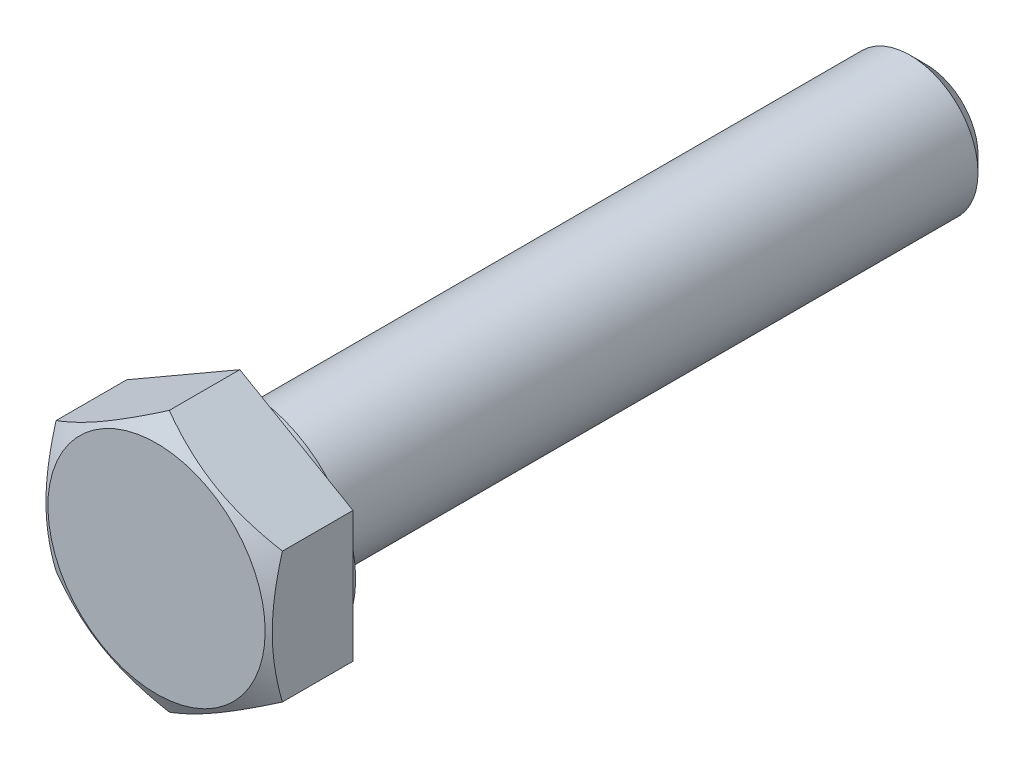
ISO-10303-21;
HEADER;
FILE_DESCRIPTION(('STEP AP214'),'2;1');
FILE_NAME('part.step','',(''),(''),'','','');
FILE_SCHEMA(('AUTOMOTIVE_DESIGN { 1 0 10303 214 1 1 1 1 }'));
ENDSEC;
DATA;
#1=APPLICATION_CONTEXT('core data for automotive mechanical design processes');
#2=APPLICATION_PROTOCOL_DEFINITION('international standard','automotive_design',2000,#1);
#3=PRODUCT_CONTEXT('',#1,'mechanical');
#4=PRODUCT('Part','Part','',(#3));
#5=PRODUCT_RELATED_PRODUCT_CATEGORY('part','',(#4));
#6=PRODUCT_DEFINITION_FORMATION('','',#4);
#7=PRODUCT_DEFINITION_CONTEXT('part definition',#1,'design');
#8=PRODUCT_DEFINITION('design','',#6,#7);
#9=PRODUCT_DEFINITION_SHAPE('','',#8);
#10=(LENGTH_UNIT() NAMED_UNIT(*) SI_UNIT(.MILLI.,.METRE.));
#11=(NAMED_UNIT(*) PLANE_ANGLE_UNIT() SI_UNIT($,.RADIAN.));
#12=(NAMED_UNIT(*) SI_UNIT($,.STERADIAN.) SOLID_ANGLE_UNIT());
#13=UNCERTAINTY_MEASURE_WITH_UNIT(LENGTH_MEASURE(1.E-05),#10,'distance_accuracy_value','');
#14=(GEOMETRIC_REPRESENTATION_CONTEXT(3) GLOBAL_UNCERTAINTY_ASSIGNED_CONTEXT((#13)) GLOBAL_UNIT_ASSIGNED_CONTEXT((#10,
#11,#12)) REPRESENTATION_CONTEXT('',''));
#15=CARTESIAN_POINT('',(0.,0.,0.));
#16=DIRECTION('',(0.,0.,1.));
#17=DIRECTION('',(1.,0.,0.));
#18=AXIS2_PLACEMENT_3D('',#15,#16,#17);
#19=CARTESIAN_POINT('',(0.,5.77350269189626,13.32));
#20=DIRECTION('',(0.,0.,1.));
#21=DIRECTION('',(1.,0.,0.));
#22=AXIS2_PLACEMENT_3D('',#19,#20,#21);
#23=PLANE('',#22);
#24=CARTESIAN_POINT('',(0.,0.,13.32));
#25=DIRECTION('',(0.,0.,1.));
#26=DIRECTION('',(1.,0.,0.));
#27=AXIS2_PLACEMENT_3D('',#24,#25,#26);
#28=CIRCLE('',#27,4.8);
#29=CARTESIAN_POINT('',(4.8,0.,13.32));
#30=VERTEX_POINT('',#29);
#31=EDGE_CURVE('E186',#30,#30,#28,.T.);
#32=ORIENTED_EDGE('',*,*,#31,.T.);
#33=EDGE_LOOP('',(#32));
#34=FACE_BOUND('',#33,.T.);
#35=DIRECTION('',(0.,1.,0.));
#36=VECTOR('',#35,1.);
#37=CARTESIAN_POINT('',(5.,5.77350269189626,13.32));
#38=LINE('',#37,#36);
#39=CARTESIAN_POINT('',(5.,-2.88675134594813,13.32));
#40=VERTEX_POINT('',#39);
#41=CARTESIAN_POINT('',(5.,2.88675134594813,13.32));
#42=VERTEX_POINT('',#41);
#43=EDGE_CURVE('E12',#40,#42,#38,.T.);
#44=ORIENTED_EDGE('',*,*,#43,.F.);
#45=DIRECTION('',(0.866025403784439,0.5,0.));
#46=VECTOR('',#45,1.);
#47=CARTESIAN_POINT('',(5.,-2.88675134594813,13.32));
#48=LINE('',#47,#46);
#49=CARTESIAN_POINT('',(0.,-5.77350269189626,13.32));
#50=VERTEX_POINT('',#49);
#51=EDGE_CURVE('E46',#50,#40,#48,.T.);
#52=ORIENTED_EDGE('',*,*,#51,.F.);
#53=DIRECTION('',(0.866025403784439,-0.5,0.));
#54=VECTOR('',#53,1.);
#55=CARTESIAN_POINT('',(-5.,-2.88675134594813,13.32));
#56=LINE('',#55,#54);
#57=CARTESIAN_POINT('',(-5.,-2.88675134594813,13.32));
#58=VERTEX_POINT('',#57);
#59=EDGE_CURVE('E108',#58,#50,#56,.T.);
#60=ORIENTED_EDGE('',*,*,#59,.F.);
#61=DIRECTION('',(0.,-1.,0.));
#62=VECTOR('',#61,1.);
#63=CARTESIAN_POINT('',(-5.,5.77350269189626,13.32));
#64=LINE('',#63,#62);
#65=CARTESIAN_POINT('',(-5.,2.88675134594813,13.32));
#66=VERTEX_POINT('',#65);
#67=EDGE_CURVE('E106',#66,#58,#64,.T.);
#68=ORIENTED_EDGE('',*,*,#67,.F.);
#69=DIRECTION('',(-0.866025403784439,-0.5,0.));
#70=VECTOR('',#69,1.);
#71=CARTESIAN_POINT('',(0.,5.77350269189626,13.32));
#72=LINE('',#71,#70);
#73=CARTESIAN_POINT('',(0.,5.77350269189626,13.32));
#74=VERTEX_POINT('',#73);
#75=EDGE_CURVE('E92',#74,#66,#72,.T.);
#76=ORIENTED_EDGE('',*,*,#75,.F.);
#77=DIRECTION('',(-0.866025403784439,0.5,0.));
#78=VECTOR('',#77,1.);
#79=CARTESIAN_POINT('',(0.,5.77350269189626,13.32));
#80=LINE('',#79,#78);
#81=EDGE_CURVE('E87',#42,#74,#80,.T.);
#82=ORIENTED_EDGE('',*,*,#81,.F.);
#83=EDGE_LOOP('',(#44,#52,#60,#68,#76,#82));
#84=FACE_BOUND('',#83,.T.);
#85=ADVANCED_FACE('F38',(#34,#84),#23,.F.);
#86=CARTESIAN_POINT('',(0.,0.,17.));
#87=DIRECTION('',(0.,0.,1.));
#88=DIRECTION('',(1.,0.,0.));
#89=AXIS2_PLACEMENT_3D('',#86,#87,#88);
#90=CYLINDRICAL_SURFACE('',#89,4.8);
#91=ORIENTED_EDGE('',*,*,#31,.F.);
#92=EDGE_LOOP('',(#91));
#93=FACE_BOUND('',#92,.T.);
#94=CARTESIAN_POINT('',(0.,0.,13.));
#95=DIRECTION('',(0.,0.,1.));
#96=DIRECTION('',(1.,0.,0.));
#97=AXIS2_PLACEMENT_3D('',#94,#95,#96);
#98=CIRCLE('',#97,4.8);
#99=CARTESIAN_POINT('',(4.8,0.,13.));
#100=VERTEX_POINT('',#99);
#101=EDGE_CURVE('E183',#100,#100,#98,.T.);
#102=ORIENTED_EDGE('',*,*,#101,.T.);
#103=EDGE_LOOP('',(#102));
#104=FACE_BOUND('',#103,.T.);
#105=ADVANCED_FACE('F221',(#93,#104),#90,.T.);
#106=CARTESIAN_POINT('',(0.,4.8,13.));
#107=DIRECTION('',(0.,0.,1.));
#108=DIRECTION('',(1.,0.,0.));
#109=AXIS2_PLACEMENT_3D('',#106,#107,#108);
#110=PLANE('',#109);
#111=ORIENTED_EDGE('',*,*,#101,.F.);
#112=EDGE_LOOP('',(#111));
#113=FACE_BOUND('',#112,.T.);
#114=CARTESIAN_POINT('',(0.,0.,13.));
#115=DIRECTION('',(0.,0.,1.));
#116=DIRECTION('',(1.,0.,0.));
#117=AXIS2_PLACEMENT_3D('',#114,#115,#116);
#118=CIRCLE('',#117,3.);
#119=CARTESIAN_POINT('',(3.,0.,13.));
#120=VERTEX_POINT('',#119);
#121=EDGE_CURVE('E180',#120,#120,#118,.T.);
#122=ORIENTED_EDGE('',*,*,#121,.T.);
#123=EDGE_LOOP('',(#122));
#124=FACE_BOUND('',#123,.T.);
#125=ADVANCED_FACE('F226',(#113,#124),#110,.F.);
#126=CARTESIAN_POINT('',(0.,0.,17.));
#127=DIRECTION('',(0.,0.,1.));
#128=DIRECTION('',(1.,0.,0.));
#129=AXIS2_PLACEMENT_3D('',#126,#127,#128);
#130=CYLINDRICAL_SURFACE('',#129,3.);
#131=ORIENTED_EDGE('',*,*,#121,.F.);
#132=EDGE_LOOP('',(#131));
#133=FACE_BOUND('',#132,.T.);
#134=CARTESIAN_POINT('',(0.,0.,-16.3));
#135=DIRECTION('',(0.,0.,1.));
#136=DIRECTION('',(1.,0.,0.));
#137=AXIS2_PLACEMENT_3D('',#134,#135,#136);
#138=CIRCLE('',#137,3.);
#139=CARTESIAN_POINT('',(3.,0.,-16.3));
#140=VERTEX_POINT('',#139);
#141=EDGE_CURVE('E177',#140,#140,#138,.T.);
#142=ORIENTED_EDGE('',*,*,#141,.T.);
#143=EDGE_LOOP('',(#142));
#144=FACE_BOUND('',#143,.T.);
#145=ADVANCED_FACE('F232',(#133,#144),#130,.T.);
#146=CARTESIAN_POINT('',(0.,0.,-17.));
#147=DIRECTION('',(0.,0.,1.));
#148=DIRECTION('',(1.,0.,0.));
#149=AXIS2_PLACEMENT_3D('',#146,#147,#148);
#150=CONICAL_SURFACE('',#149,2.29999999999999,0.785398163397453);
#151=ORIENTED_EDGE('',*,*,#141,.F.);
#152=EDGE_LOOP('',(#151));
#153=FACE_BOUND('',#152,.T.);
#154=CARTESIAN_POINT('',(0.,0.,-17.));
#155=DIRECTION('',(0.,0.,1.));
#156=DIRECTION('',(1.,0.,0.));
#157=AXIS2_PLACEMENT_3D('',#154,#155,#156);
#158=CIRCLE('',#157,2.29999999999999);
#159=CARTESIAN_POINT('',(2.29999999999999,0.,-17.));
#160=VERTEX_POINT('',#159);
#161=EDGE_CURVE('E167',#160,#160,#158,.T.);
#162=ORIENTED_EDGE('',*,*,#161,.T.);
#163=EDGE_LOOP('',(#162));
#164=FACE_BOUND('',#163,.T.);
#165=ADVANCED_FACE('F235',(#153,#164),#150,.T.);
#166=CARTESIAN_POINT('',(0.,2.29999999999999,-17.));
#167=DIRECTION('',(0.,0.,1.));
#168=DIRECTION('',(1.,0.,0.));
#169=AXIS2_PLACEMENT_3D('',#166,#167,#168);
#170=PLANE('',#169);
#171=ORIENTED_EDGE('',*,*,#161,.F.);
#172=EDGE_LOOP('',(#171));
#173=FACE_BOUND('',#172,.T.);
#174=ADVANCED_FACE('F158',(#173),#170,.F.);
#175=CARTESIAN_POINT('',(5.,-2.88675134594813,-17.));
#176=DIRECTION('',(1.,0.,0.));
#177=DIRECTION('',(0.,0.,-1.));
#178=AXIS2_PLACEMENT_3D('',#175,#176,#177);
#179=PLANE('',#178);
#180=CARTESIAN_POINT('',(5.,-7.64008573889742,14.499630377463));
#181=CARTESIAN_POINT('',(5.,-7.42068159590081,14.6055920100013));
#182=CARTESIAN_POINT('',(5.,-7.20075689313152,14.710495379141));
#183=CARTESIAN_POINT('',(5.,-6.75958482868371,14.9175804830405));
#184=CARTESIAN_POINT('',(5.,-6.53833724435119,15.0197617428973));
#185=CARTESIAN_POINT('',(5.,-6.09303477351777,15.2213393251463));
#186=CARTESIAN_POINT('',(5.,-5.86897105717839,15.3207162124602));
#187=CARTESIAN_POINT('',(5.,-5.41899608184928,15.5151783881317));
#188=CARTESIAN_POINT('',(5.,-5.19308492041238,15.6102639013854));
#189=CARTESIAN_POINT('',(5.,-4.73632589760452,15.7960998320038));
#190=CARTESIAN_POINT('',(5.,-4.50545130101547,15.8867848999223));
#191=CARTESIAN_POINT('',(5.,-4.04097325881019,16.0610125408302));
#192=CARTESIAN_POINT('',(5.,-3.80736951243133,16.1445543179996));
#193=CARTESIAN_POINT('',(5.,-3.33754668714114,16.3022389324202));
#194=CARTESIAN_POINT('',(5.,-3.10133443213912,16.3764018929248));
#195=CARTESIAN_POINT('',(5.,-2.62555260054899,16.5129099804785));
#196=CARTESIAN_POINT('',(5.,-2.38598411525087,16.5752588573439));
#197=CARTESIAN_POINT('',(5.,-1.90331981578052,16.6851032564927));
#198=CARTESIAN_POINT('',(5.,-1.66022288732634,16.7325939748645));
#199=CARTESIAN_POINT('',(5.,-1.17111612924988,16.809510832183));
#200=CARTESIAN_POINT('',(5.,-0.925106294108409,16.8389369368963));
#201=CARTESIAN_POINT('',(5.,-0.433007357321366,16.8771209931724));
#202=CARTESIAN_POINT('',(5.,-0.186928539140977,16.88600811353));
#203=CARTESIAN_POINT('',(5.,0.305030324457192,16.8826491483311));
#204=CARTESIAN_POINT('',(5.,0.550910404613566,16.8704084664303));
#205=CARTESIAN_POINT('',(5.,0.971189606769672,16.8322860132342));
#206=CARTESIAN_POINT('',(5.,1.14605416097908,16.8112666395585));
#207=CARTESIAN_POINT('',(5.,1.49442112399169,16.7599167143594));
#208=CARTESIAN_POINT('',(5.,1.66792332467769,16.7295847675469));
#209=CARTESIAN_POINT('',(5.,2.18666119826033,16.6261300000214));
#210=CARTESIAN_POINT('',(5.,2.52944904030543,16.540617691086));
#211=CARTESIAN_POINT('',(5.,3.04217461322416,16.3933052936081));
#212=CARTESIAN_POINT('',(5.,3.21479282598057,16.3403117395096));
#213=CARTESIAN_POINT('',(5.,3.55836136344024,16.229073241113));
#214=CARTESIAN_POINT('',(5.,3.72931153679484,16.170827825111));
#215=CARTESIAN_POINT('',(5.,4.06869092485971,16.0503313817446));
#216=CARTESIAN_POINT('',(5.,4.23712892703844,15.9881048549994));
#217=CARTESIAN_POINT('',(5.,4.57257364838415,15.8600688785644));
#218=CARTESIAN_POINT('',(5.,4.73958084210369,15.7942606746182));
#219=CARTESIAN_POINT('',(5.,4.90598590270293,15.7269973555927));
#220=B_SPLINE_CURVE_WITH_KNOTS('',3,(#180,#181,#182,#183,#184,#185,#186,#187,#188,#189,#190,
#191,#192,#193,#194,#195,#196,#197,#198,#199,#200,#201,#202,#203,#204,#205,#206,#207,#208,#209,
#210,#211,#212,#213,#214,#215,#216,#217,#218,#219),.UNSPECIFIED.,.F.,.F.,(4,2,2,2,2,2,2,2,2,2,2,
2,2,2,2,2,2,2,2,4),(0.,0.730964352361358,1.46205540558399,2.19735822775906,2.93262247040582,
3.67666940405851,4.42079912282938,5.16330411937892,5.90557304696753,6.64808171612083,
7.39059179236161,8.12841939633898,8.86605832117363,9.39417040541198,9.92236165454992,
10.980782885741,11.5224492040927,12.0641642215673,12.6028174369748,13.141284485932),.UNSPECIFIED.);
#221=CARTESIAN_POINT('',(5.,2.88675134594813,16.4379479587769));
#222=VERTEX_POINT('',#221);
#223=CARTESIAN_POINT('',(5.,-2.88675134594813,16.4379479587769));
#224=VERTEX_POINT('',#223);
#225=EDGE_CURVE('E125',#222,#224,#220,.F.);
#226=ORIENTED_EDGE('',*,*,#225,.T.);
#227=DIRECTION('',(0.,0.,1.));
#228=VECTOR('',#227,1.);
#229=CARTESIAN_POINT('',(5.,-2.88675134594813,-17.));
#230=LINE('',#229,#228);
#231=EDGE_CURVE('E118',#40,#224,#230,.T.);
#232=ORIENTED_EDGE('',*,*,#231,.F.);
#233=ORIENTED_EDGE('',*,*,#43,.T.);
#234=DIRECTION('',(0.,0.,1.));
#235=VECTOR('',#234,1.);
#236=CARTESIAN_POINT('',(5.,2.88675134594813,-17.));
#237=LINE('',#236,#235);
#238=EDGE_CURVE('E58',#42,#222,#237,.T.);
#239=ORIENTED_EDGE('',*,*,#238,.T.);
#240=EDGE_LOOP('',(#226,#232,#233,#239));
#241=FACE_BOUND('',#240,.T.);
#242=ADVANCED_FACE('F123',(#241),#179,.T.);
#243=CARTESIAN_POINT('',(0.,-5.77350269189626,-17.));
#244=DIRECTION('',(0.5,-0.866025403784439,0.));
#245=DIRECTION('',(0.866025403784439,0.5,0.));
#246=AXIS2_PLACEMENT_3D('',#243,#244,#245);
#247=PLANE('',#246);
#248=CARTESIAN_POINT('',(5.0002,-2.88663587589429,16.4378812901102));
#249=CARTESIAN_POINT('',(4.78046540547481,-3.01349970319368,16.5111433785244));
#250=CARTESIAN_POINT('',(4.55885141554042,-3.14144859993849,16.577778624244));
#251=CARTESIAN_POINT('',(4.11178600454648,-3.39956193532121,16.6940909551513));
#252=CARTESIAN_POINT('',(3.88632664040922,-3.52973095989718,16.7437268962463));
#253=CARTESIAN_POINT('',(3.43816769477649,-3.78847564779797,16.8209789207434));
#254=CARTESIAN_POINT('',(3.2155379068958,-3.91701101576052,16.8491095678786));
#255=CARTESIAN_POINT('',(2.88081009815336,-4.11026620624322,16.8743350242084));
#256=CARTESIAN_POINT('',(2.76915780319494,-4.17472868879311,16.8799164863926));
#257=CARTESIAN_POINT('',(2.5457500293262,-4.30371322717528,16.8853277294106));
#258=CARTESIAN_POINT('',(2.43399455370968,-4.36823528110589,16.8851576879039));
#259=CARTESIAN_POINT('',(2.12781576914936,-4.54500768479194,16.87677631437));
#260=CARTESIAN_POINT('',(1.93349391403278,-4.65719946015292,16.8627001742648));
#261=CARTESIAN_POINT('',(1.54613989800229,-4.88083840557981,16.8180646890526));
#262=CARTESIAN_POINT('',(1.35310909862843,-4.9922847895602,16.7874900860146));
#263=CARTESIAN_POINT('',(0.964974657525143,-5.21637431361295,16.7110614525409));
#264=CARTESIAN_POINT('',(0.769920001358261,-5.32898917185759,16.6648835672834));
#265=CARTESIAN_POINT('',(0.382719654641229,-5.55253939626498,16.5600781516701));
#266=CARTESIAN_POINT('',(0.190569004591911,-5.66347762579591,16.5014752427247));
#267=CARTESIAN_POINT('',(-0.000200000000002552,-5.77361816195009,16.4378812901102));
#268=B_SPLINE_CURVE_WITH_KNOTS('',3,(#248,#249,#250,#251,#252,#253,#254,#255,#256,#257,#258,
#259,#260,#261,#262,#263,#264,#265,#266,#267),.UNSPECIFIED.,.F.,.F.,(4,2,2,2,2,2,2,2,2,4),(0.,
0.79255584136309,1.58701660053333,2.3618153748728,2.74884076077325,3.13585419177295,
3.80962362599679,4.48401723901189,5.17336882348928,5.86136694793725),.UNSPECIFIED.);
#269=CARTESIAN_POINT('',(0.,-5.77350269189626,16.4379479587769));
#270=VERTEX_POINT('',#269);
#271=EDGE_CURVE('E168',#224,#270,#268,.T.);
#272=ORIENTED_EDGE('',*,*,#271,.T.);
#273=DIRECTION('',(0.,0.,1.));
#274=VECTOR('',#273,1.);
#275=CARTESIAN_POINT('',(0.,-5.77350269189626,-17.));
#276=LINE('',#275,#274);
#277=EDGE_CURVE('E121',#50,#270,#276,.T.);
#278=ORIENTED_EDGE('',*,*,#277,.F.);
#279=ORIENTED_EDGE('',*,*,#51,.T.);
#280=ORIENTED_EDGE('',*,*,#231,.T.);
#281=EDGE_LOOP('',(#272,#278,#279,#280));
#282=FACE_BOUND('',#281,.T.);
#283=ADVANCED_FACE('F117',(#282),#247,.T.);
#284=CARTESIAN_POINT('',(-5.,-2.88675134594813,-17.));
#285=DIRECTION('',(-0.5,-0.866025403784439,0.));
#286=DIRECTION('',(0.866025403784439,-0.5,0.));
#287=AXIS2_PLACEMENT_3D('',#284,#285,#286);
#288=PLANE('',#287);
#289=CARTESIAN_POINT('',(0.000199999999997622,-5.77361816195009,16.4378812901102));
#290=CARTESIAN_POINT('',(-0.219534594525187,-5.6467543346507,16.5111433785244));
#291=CARTESIAN_POINT('',(-0.441148584459582,-5.51880543790589,16.577778624244));
#292=CARTESIAN_POINT('',(-0.888213995453514,-5.26069210252318,16.6940909551513));
#293=CARTESIAN_POINT('',(-1.11367335959078,-5.13052307794721,16.7437268962463));
#294=CARTESIAN_POINT('',(-1.56183230522351,-4.87177839004641,16.8209789207434));
#295=CARTESIAN_POINT('',(-1.78446209310419,-4.74324302208387,16.8491095678786));
#296=CARTESIAN_POINT('',(-2.11918990184664,-4.54998783160116,16.8743350242084));
#297=CARTESIAN_POINT('',(-2.23084219680506,-4.48552534905128,16.8799164863926));
#298=CARTESIAN_POINT('',(-2.4542499706738,-4.35654081066911,16.8853277294106));
#299=CARTESIAN_POINT('',(-2.56600544629031,-4.2920187567385,16.8851576879039));
#300=CARTESIAN_POINT('',(-2.87218423085064,-4.11524635305244,16.87677631437));
#301=CARTESIAN_POINT('',(-3.06650608596721,-4.00305457769146,16.8627001742648));
#302=CARTESIAN_POINT('',(-3.4538601019977,-3.77941563226457,16.8180646890526));
#303=CARTESIAN_POINT('',(-3.64689090137157,-3.66796924828418,16.7874900860146));
#304=CARTESIAN_POINT('',(-4.03502534247485,-3.44387972423144,16.7110614525409));
#305=CARTESIAN_POINT('',(-4.23007999864173,-3.3312648659868,16.6648835672834));
#306=CARTESIAN_POINT('',(-4.61728034535877,-3.1077146415794,16.5600781516701));
#307=CARTESIAN_POINT('',(-4.80943099540808,-2.99677641204847,16.5014752427247));
#308=CARTESIAN_POINT('',(-5.0002,-2.88663587589429,16.4378812901102));
#309=B_SPLINE_CURVE_WITH_KNOTS('',3,(#289,#290,#291,#292,#293,#294,#295,#296,#297,#298,#299,
#300,#301,#302,#303,#304,#305,#306,#307,#308),.UNSPECIFIED.,.F.,.F.,(4,2,2,2,2,2,2,2,2,4),(0.,
0.792555841363089,1.58701660053333,2.3618153748728,2.74884076077325,3.13585419177295,
3.80962362599679,4.48401723901189,5.17336882348928,5.86136694793725),.UNSPECIFIED.);
#310=CARTESIAN_POINT('',(-5.,-2.88675134594813,16.4379479587769));
#311=VERTEX_POINT('',#310);
#312=EDGE_CURVE('E196',#270,#311,#309,.T.);
#313=ORIENTED_EDGE('',*,*,#312,.T.);
#314=DIRECTION('',(0.,0.,1.));
#315=VECTOR('',#314,1.);
#316=CARTESIAN_POINT('',(-5.,-2.88675134594813,-17.));
#317=LINE('',#316,#315);
#318=EDGE_CURVE('E129',#58,#311,#317,.T.);
#319=ORIENTED_EDGE('',*,*,#318,.F.);
#320=ORIENTED_EDGE('',*,*,#59,.T.);
#321=ORIENTED_EDGE('',*,*,#277,.T.);
#322=EDGE_LOOP('',(#313,#319,#320,#321));
#323=FACE_BOUND('',#322,.T.);
#324=ADVANCED_FACE('F209',(#323),#288,.T.);
#325=CARTESIAN_POINT('',(-5.,2.88675134594813,-17.));
#326=DIRECTION('',(-1.,0.,0.));
#327=DIRECTION('',(0.,0.,1.));
#328=AXIS2_PLACEMENT_3D('',#325,#326,#327);
#329=PLANE('',#328);
#330=CARTESIAN_POINT('',(-5.,-7.64008573889742,14.499630377463));
#331=CARTESIAN_POINT('',(-5.,-7.42068159590081,14.6055920100013));
#332=CARTESIAN_POINT('',(-5.,-7.20075689313152,14.710495379141));
#333=CARTESIAN_POINT('',(-5.,-6.75958482868371,14.9175804830405));
#334=CARTESIAN_POINT('',(-5.,-6.53833724435119,15.0197617428973));
#335=CARTESIAN_POINT('',(-5.,-6.09303477351777,15.2213393251463));
#336=CARTESIAN_POINT('',(-5.,-5.86897105717839,15.3207162124602));
#337=CARTESIAN_POINT('',(-5.,-5.41899608184928,15.5151783881317));
#338=CARTESIAN_POINT('',(-5.,-5.19308492041238,15.6102639013854));
#339=CARTESIAN_POINT('',(-5.,-4.73632589760452,15.7960998320038));
#340=CARTESIAN_POINT('',(-5.,-4.50545130101547,15.8867848999223));
#341=CARTESIAN_POINT('',(-5.,-4.04097325881019,16.0610125408302));
#342=CARTESIAN_POINT('',(-5.,-3.80736951243133,16.1445543179996));
#343=CARTESIAN_POINT('',(-5.,-3.33754668714113,16.3022389324202));
#344=CARTESIAN_POINT('',(-5.,-3.10133443213912,16.3764018929248));
#345=CARTESIAN_POINT('',(-5.,-2.62555260054899,16.5129099804785));
#346=CARTESIAN_POINT('',(-5.,-2.38598411525087,16.5752588573439));
#347=CARTESIAN_POINT('',(-5.,-1.90331981578052,16.6851032564927));
#348=CARTESIAN_POINT('',(-5.,-1.66022288732634,16.7325939748645));
#349=CARTESIAN_POINT('',(-5.,-1.17111612924988,16.809510832183));
#350=CARTESIAN_POINT('',(-5.,-0.925106294108409,16.8389369368963));
#351=CARTESIAN_POINT('',(-5.,-0.433007357321367,16.8771209931724));
#352=CARTESIAN_POINT('',(-5.,-0.186928539140978,16.88600811353));
#353=CARTESIAN_POINT('',(-5.,0.305030324457192,16.8826491483311));
#354=CARTESIAN_POINT('',(-5.,0.550910404613565,16.8704084664303));
#355=CARTESIAN_POINT('',(-5.,0.971189606769672,16.8322860132342));
#356=CARTESIAN_POINT('',(-5.,1.14605416097908,16.8112666395585));
#357=CARTESIAN_POINT('',(-5.,1.4944211239917,16.7599167143594));
#358=CARTESIAN_POINT('',(-5.,1.66792332467769,16.7295847675469));
#359=CARTESIAN_POINT('',(-5.,2.18666119826033,16.6261300000214));
#360=CARTESIAN_POINT('',(-5.,2.52944904030543,16.540617691086));
#361=CARTESIAN_POINT('',(-5.,3.04217461322416,16.3933052936081));
#362=CARTESIAN_POINT('',(-5.,3.21479282598058,16.3403117395096));
#363=CARTESIAN_POINT('',(-5.,3.55836136344024,16.229073241113));
#364=CARTESIAN_POINT('',(-5.,3.72931153679484,16.170827825111));
#365=CARTESIAN_POINT('',(-5.,4.06869092485971,16.0503313817446));
#366=CARTESIAN_POINT('',(-5.,4.23712892703844,15.9881048549994));
#367=CARTESIAN_POINT('',(-5.,4.57257364838415,15.8600688785644));
#368=CARTESIAN_POINT('',(-5.,4.73958084210369,15.7942606746182));
#369=CARTESIAN_POINT('',(-5.,4.90598590270293,15.7269973555927));
#370=B_SPLINE_CURVE_WITH_KNOTS('',3,(#330,#331,#332,#333,#334,#335,#336,#337,#338,#339,#340,
#341,#342,#343,#344,#345,#346,#347,#348,#349,#350,#351,#352,#353,#354,#355,#356,#357,#358,#359,
#360,#361,#362,#363,#364,#365,#366,#367,#368,#369),.UNSPECIFIED.,.F.,.F.,(4,2,2,2,2,2,2,2,2,2,2,
2,2,2,2,2,2,2,2,4),(0.,0.730964352361358,1.46205540558399,2.19735822775906,2.93262247040582,
3.67666940405851,4.42079912282938,5.16330411937892,5.90557304696753,6.64808171612083,
7.39059179236161,8.12841939633898,8.86605832117363,9.39417040541198,9.92236165454992,
10.980782885741,11.5224492040927,12.0641642215673,12.6028174369748,13.141284485932),.UNSPECIFIED.);
#371=CARTESIAN_POINT('',(-5.,2.88675134594813,16.4379479587769));
#372=VERTEX_POINT('',#371);
#373=EDGE_CURVE('E197',#311,#372,#370,.T.);
#374=ORIENTED_EDGE('',*,*,#373,.T.);
#375=DIRECTION('',(0.,0.,1.));
#376=VECTOR('',#375,1.);
#377=CARTESIAN_POINT('',(-5.,2.88675134594813,-17.));
#378=LINE('',#377,#376);
#379=EDGE_CURVE('E102',#66,#372,#378,.T.);
#380=ORIENTED_EDGE('',*,*,#379,.F.);
#381=ORIENTED_EDGE('',*,*,#67,.T.);
#382=ORIENTED_EDGE('',*,*,#318,.T.);
#383=EDGE_LOOP('',(#374,#380,#381,#382));
#384=FACE_BOUND('',#383,.T.);
#385=ADVANCED_FACE('F212',(#384),#329,.T.);
#386=CARTESIAN_POINT('',(0.,5.77350269189626,-17.));
#387=DIRECTION('',(-0.5,0.866025403784439,0.));
#388=DIRECTION('',(-0.866025403784439,-0.5,0.));
#389=AXIS2_PLACEMENT_3D('',#386,#387,#388);
#390=PLANE('',#389);
#391=CARTESIAN_POINT('',(-5.0002,2.88663587589429,16.4378812901102));
#392=CARTESIAN_POINT('',(-4.78046540547481,3.01349970319368,16.5111433785244));
#393=CARTESIAN_POINT('',(-4.55885141554042,3.14144859993849,16.577778624244));
#394=CARTESIAN_POINT('',(-4.11178600454649,3.39956193532121,16.6940909551513));
#395=CARTESIAN_POINT('',(-3.88632664040923,3.52973095989718,16.7437268962463));
#396=CARTESIAN_POINT('',(-3.43816769477649,3.78847564779798,16.8209789207434));
#397=CARTESIAN_POINT('',(-3.21553790689581,3.91701101576052,16.8491095678786));
#398=CARTESIAN_POINT('',(-2.88081009815336,4.11026620624323,16.8743350242084));
#399=CARTESIAN_POINT('',(-2.76915780319494,4.17472868879311,16.8799164863926));
#400=CARTESIAN_POINT('',(-2.5457500293262,4.30371322717528,16.8853277294106));
#401=CARTESIAN_POINT('',(-2.43399455370969,4.36823528110589,16.8851576879039));
#402=CARTESIAN_POINT('',(-2.12781576914936,4.54500768479194,16.87677631437));
#403=CARTESIAN_POINT('',(-1.93349391403279,4.65719946015292,16.8627001742648));
#404=CARTESIAN_POINT('',(-1.54613989800229,4.88083840557981,16.8180646890526));
#405=CARTESIAN_POINT('',(-1.35310909862843,4.9922847895602,16.7874900860146));
#406=CARTESIAN_POINT('',(-0.964974657525145,5.21637431361295,16.7110614525409));
#407=CARTESIAN_POINT('',(-0.769920001358264,5.32898917185759,16.6648835672834));
#408=CARTESIAN_POINT('',(-0.382719654641232,5.55253939626498,16.5600781516701));
#409=CARTESIAN_POINT('',(-0.190569004591914,5.66347762579592,16.5014752427247));
#410=CARTESIAN_POINT('',(0.000199999999999846,5.7736181619501,16.4378812901102));
#411=B_SPLINE_CURVE_WITH_KNOTS('',3,(#391,#392,#393,#394,#395,#396,#397,#398,#399,#400,#401,
#402,#403,#404,#405,#406,#407,#408,#409,#410),.UNSPECIFIED.,.F.,.F.,(4,2,2,2,2,2,2,2,2,4),(0.,
0.792555841363089,1.58701660053333,2.3618153748728,2.74884076077325,3.13585419177295,
3.80962362599679,4.48401723901189,5.17336882348928,5.86136694793725),.UNSPECIFIED.);
#412=CARTESIAN_POINT('',(0.,5.77350269189626,16.4379479587769));
#413=VERTEX_POINT('',#412);
#414=EDGE_CURVE('E100',#372,#413,#411,.T.);
#415=ORIENTED_EDGE('',*,*,#414,.T.);
#416=DIRECTION('',(0.,0.,1.));
#417=VECTOR('',#416,1.);
#418=CARTESIAN_POINT('',(0.,5.77350269189626,-17.));
#419=LINE('',#418,#417);
#420=EDGE_CURVE('E53',#74,#413,#419,.T.);
#421=ORIENTED_EDGE('',*,*,#420,.F.);
#422=ORIENTED_EDGE('',*,*,#75,.T.);
#423=ORIENTED_EDGE('',*,*,#379,.T.);
#424=EDGE_LOOP('',(#415,#421,#422,#423));
#425=FACE_BOUND('',#424,.T.);
#426=ADVANCED_FACE('F96',(#425),#390,.T.);
#427=CARTESIAN_POINT('',(5.,2.88675134594813,-17.));
#428=DIRECTION('',(0.5,0.866025403784439,0.));
#429=DIRECTION('',(-0.866025403784439,0.5,0.));
#430=AXIS2_PLACEMENT_3D('',#427,#428,#429);
#431=PLANE('',#430);
#432=CARTESIAN_POINT('',(-0.000200000000000032,5.7736181619501,16.4378812901102));
#433=CARTESIAN_POINT('',(0.219534594525184,5.64675433465071,16.5111433785244));
#434=CARTESIAN_POINT('',(0.44114858445958,5.5188054379059,16.577778624244));
#435=CARTESIAN_POINT('',(0.888213995453512,5.26069210252318,16.6940909551513));
#436=CARTESIAN_POINT('',(1.11367335959077,5.13052307794721,16.7437268962463));
#437=CARTESIAN_POINT('',(1.56183230522351,4.87177839004641,16.8209789207434));
#438=CARTESIAN_POINT('',(1.78446209310419,4.74324302208387,16.8491095678786));
#439=CARTESIAN_POINT('',(2.11918990184664,4.54998783160116,16.8743350242084));
#440=CARTESIAN_POINT('',(2.23084219680506,4.48552534905128,16.8799164863926));
#441=CARTESIAN_POINT('',(2.45424997067379,4.35654081066911,16.8853277294106));
#442=CARTESIAN_POINT('',(2.56600544629031,4.2920187567385,16.8851576879039));
#443=CARTESIAN_POINT('',(2.87218423085064,4.11524635305245,16.87677631437));
#444=CARTESIAN_POINT('',(3.06650608596721,4.00305457769146,16.8627001742648));
#445=CARTESIAN_POINT('',(3.4538601019977,3.77941563226458,16.8180646890526));
#446=CARTESIAN_POINT('',(3.64689090137157,3.66796924828419,16.7874900860146));
#447=CARTESIAN_POINT('',(4.03502534247485,3.44387972423144,16.7110614525409));
#448=CARTESIAN_POINT('',(4.23007999864173,3.3312648659868,16.6648835672834));
#449=CARTESIAN_POINT('',(4.61728034535876,3.10771464157941,16.5600781516701));
#450=CARTESIAN_POINT('',(4.80943099540808,2.99677641204847,16.5014752427247));
#451=CARTESIAN_POINT('',(5.0002,2.88663587589429,16.4378812901102));
#452=B_SPLINE_CURVE_WITH_KNOTS('',3,(#432,#433,#434,#435,#436,#437,#438,#439,#440,#441,#442,
#443,#444,#445,#446,#447,#448,#449,#450,#451),.UNSPECIFIED.,.F.,.F.,(4,2,2,2,2,2,2,2,2,4),(0.,
0.792555841363089,1.58701660053333,2.3618153748728,2.74884076077325,3.13585419177295,
3.80962362599679,4.48401723901188,5.17336882348928,5.86136694793724),.UNSPECIFIED.);
#453=EDGE_CURVE('E126',#413,#222,#452,.T.);
#454=ORIENTED_EDGE('',*,*,#453,.T.);
#455=ORIENTED_EDGE('',*,*,#238,.F.);
#456=ORIENTED_EDGE('',*,*,#81,.T.);
#457=ORIENTED_EDGE('',*,*,#420,.T.);
#458=EDGE_LOOP('',(#454,#455,#456,#457));
#459=FACE_BOUND('',#458,.T.);
#460=ADVANCED_FACE('F88',(#459),#431,.T.);
#461=CARTESIAN_POINT('',(0.,0.,17.));
#462=DIRECTION('',(0.,0.,-1.));
#463=DIRECTION('',(-1.,0.,0.));
#464=AXIS2_PLACEMENT_3D('',#461,#462,#463);
#465=PLANE('',#464);
#466=CARTESIAN_POINT('',(0.,0.,17.));
#467=DIRECTION('',(0.,0.,1.));
#468=DIRECTION('',(1.,0.,0.));
#469=AXIS2_PLACEMENT_3D('',#466,#467,#468);
#470=CIRCLE('',#469,4.8);
#471=CARTESIAN_POINT('',(4.8,0.,17.));
#472=VERTEX_POINT('',#471);
#473=EDGE_CURVE('E93',#472,#472,#470,.T.);
#474=ORIENTED_EDGE('',*,*,#473,.T.);
#475=EDGE_LOOP('',(#474));
#476=FACE_BOUND('',#475,.T.);
#477=ADVANCED_FACE('F40',(#476),#465,.F.);
#478=CARTESIAN_POINT('',(0.,0.,16.4379479587769));
#479=DIRECTION('',(0.,0.,-1.));
#480=DIRECTION('',(-1.,0.,0.));
#481=AXIS2_PLACEMENT_3D('',#478,#479,#480);
#482=CONICAL_SURFACE('',#481,5.77350269189626,1.0471975511966);
#483=ORIENTED_EDGE('',*,*,#473,.F.);
#484=EDGE_LOOP('',(#483));
#485=FACE_BOUND('',#484,.T.);
#486=ORIENTED_EDGE('',*,*,#225,.F.);
#487=ORIENTED_EDGE('',*,*,#453,.F.);
#488=ORIENTED_EDGE('',*,*,#414,.F.);
#489=ORIENTED_EDGE('',*,*,#373,.F.);
#490=ORIENTED_EDGE('',*,*,#312,.F.);
#491=ORIENTED_EDGE('',*,*,#271,.F.);
#492=EDGE_LOOP('',(#486,#487,#488,#489,#490,#491));
#493=FACE_BOUND('',#492,.T.);
#494=ADVANCED_FACE('F147',(#485,#493),#482,.T.);
#495=CLOSED_SHELL('',(#85,#105,#125,#145,#165,#174,#242,#283,#324,#385,#426,#460,#477,#494));
#496=MANIFOLD_SOLID_BREP('B2',#495);
#497=ADVANCED_BREP_SHAPE_REPRESENTATION('',(#18,#496),#14);
#498=SHAPE_DEFINITION_REPRESENTATION(#9,#497);
ENDSEC;
END-ISO-10303-21;
